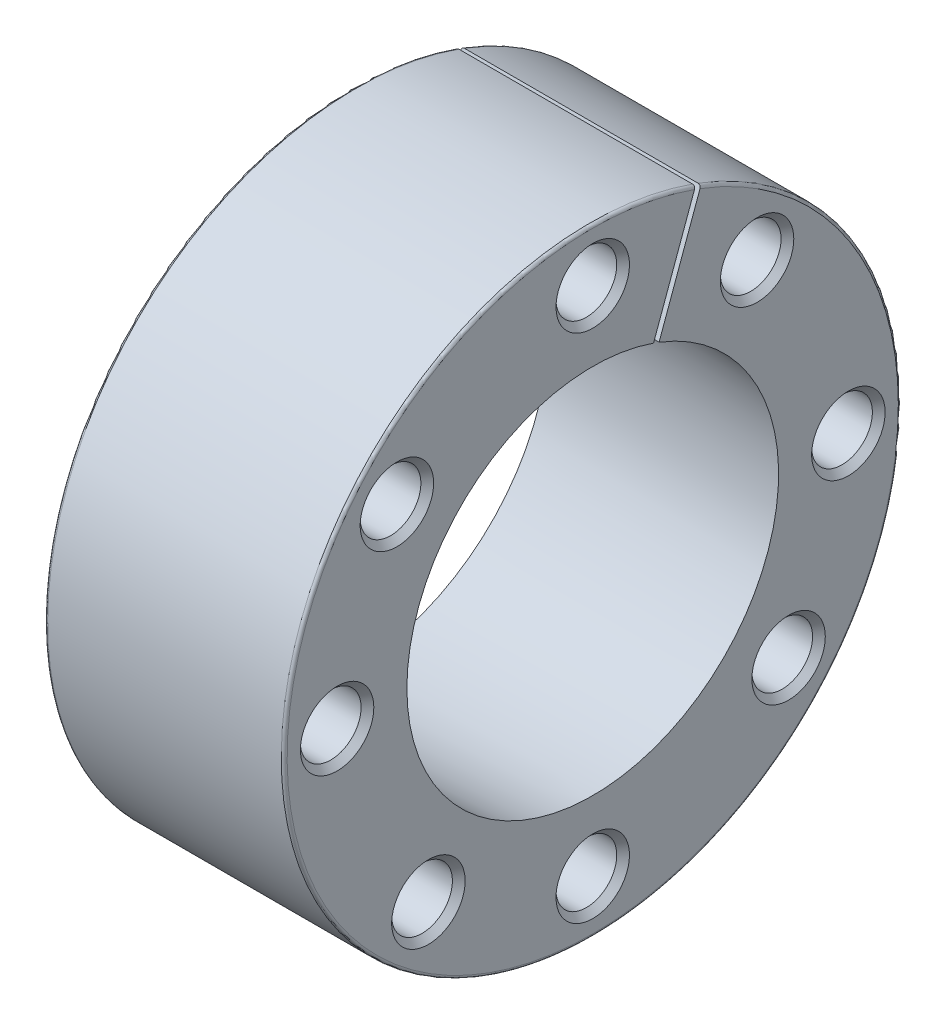
ISO-10303-21;
HEADER;
FILE_DESCRIPTION(('STEP AP214'),'2;1');
FILE_NAME('part.step','',(''),(''),'','','');
FILE_SCHEMA(('AUTOMOTIVE_DESIGN { 1 0 10303 214 1 1 1 1 }'));
ENDSEC;
DATA;
#1=APPLICATION_CONTEXT('core data for automotive mechanical design processes');
#2=APPLICATION_PROTOCOL_DEFINITION('international standard','automotive_design',2000,#1);
#3=PRODUCT_CONTEXT('',#1,'mechanical');
#4=PRODUCT('Part','Part','',(#3));
#5=PRODUCT_RELATED_PRODUCT_CATEGORY('part','',(#4));
#6=PRODUCT_DEFINITION_FORMATION('','',#4);
#7=PRODUCT_DEFINITION_CONTEXT('part definition',#1,'design');
#8=PRODUCT_DEFINITION('design','',#6,#7);
#9=PRODUCT_DEFINITION_SHAPE('','',#8);
#10=(LENGTH_UNIT() NAMED_UNIT(*) SI_UNIT(.MILLI.,.METRE.));
#11=(NAMED_UNIT(*) PLANE_ANGLE_UNIT() SI_UNIT($,.RADIAN.));
#12=(NAMED_UNIT(*) SI_UNIT($,.STERADIAN.) SOLID_ANGLE_UNIT());
#13=UNCERTAINTY_MEASURE_WITH_UNIT(LENGTH_MEASURE(1.E-05),#10,'distance_accuracy_value','');
#14=(GEOMETRIC_REPRESENTATION_CONTEXT(3) GLOBAL_UNCERTAINTY_ASSIGNED_CONTEXT((#13)) GLOBAL_UNIT_ASSIGNED_CONTEXT((#10,
#11,#12)) REPRESENTATION_CONTEXT('',''));
#15=CARTESIAN_POINT('',(0.,0.,0.));
#16=DIRECTION('',(0.,0.,1.));
#17=DIRECTION('',(1.,0.,0.));
#18=AXIS2_PLACEMENT_3D('',#15,#16,#17);
#19=CARTESIAN_POINT('',(25.1,17.4,0.));
#20=DIRECTION('',(-1.,0.,0.));
#21=DIRECTION('',(0.,0.,1.));
#22=AXIS2_PLACEMENT_3D('',#19,#20,#21);
#23=CYLINDRICAL_SURFACE('',#22,2.067);
#24=CARTESIAN_POINT('',(9.23299999999472,17.4,0.));
#25=DIRECTION('',(-1.,0.,0.));
#26=DIRECTION('',(0.,0.,1.));
#27=AXIS2_PLACEMENT_3D('',#24,#25,#26);
#28=CIRCLE('',#27,2.06699999995408);
#29=CARTESIAN_POINT('',(9.23299999999472,17.4,2.06699999995408));
#30=VERTEX_POINT('',#29);
#31=EDGE_CURVE('E222',#30,#30,#28,.T.);
#32=ORIENTED_EDGE('',*,*,#31,.T.);
#33=EDGE_LOOP('',(#32));
#34=FACE_BOUND('',#33,.T.);
#35=CARTESIAN_POINT('',(24.6670000000222,17.4,0.));
#36=DIRECTION('',(1.,0.,0.));
#37=DIRECTION('',(0.,0.,-1.));
#38=AXIS2_PLACEMENT_3D('',#35,#36,#37);
#39=CIRCLE('',#38,2.06700000001092);
#40=CARTESIAN_POINT('',(24.6670000000222,17.4,-2.06700000001092));
#41=VERTEX_POINT('',#40);
#42=EDGE_CURVE('E182',#41,#41,#39,.T.);
#43=ORIENTED_EDGE('',*,*,#42,.T.);
#44=EDGE_LOOP('',(#43));
#45=FACE_BOUND('',#44,.T.);
#46=ADVANCED_FACE('F16',(#34,#45),#23,.F.);
#47=CARTESIAN_POINT('',(25.1,13.3291733102702,-11.1845044085458));
#48=DIRECTION('',(-1.,0.,0.));
#49=DIRECTION('',(0.,0.,1.));
#50=AXIS2_PLACEMENT_3D('',#47,#48,#49);
#51=CYLINDRICAL_SURFACE('',#50,2.067);
#52=CARTESIAN_POINT('',(9.23299999999472,13.3291733102702,-11.1845044085458));
#53=DIRECTION('',(-1.,0.,0.));
#54=DIRECTION('',(0.,0.,1.));
#55=AXIS2_PLACEMENT_3D('',#52,#53,#54);
#56=CIRCLE('',#55,2.0669999999955);
#57=CARTESIAN_POINT('',(9.23299999999472,13.3291733102702,-9.1175044085503));
#58=VERTEX_POINT('',#57);
#59=EDGE_CURVE('E217',#58,#58,#56,.T.);
#60=ORIENTED_EDGE('',*,*,#59,.T.);
#61=EDGE_LOOP('',(#60));
#62=FACE_BOUND('',#61,.T.);
#63=CARTESIAN_POINT('',(24.6669999999654,13.3291733102702,-11.1845044085458));
#64=DIRECTION('',(1.,0.,0.));
#65=DIRECTION('',(0.,0.,-1.));
#66=AXIS2_PLACEMENT_3D('',#63,#64,#65);
#67=CIRCLE('',#66,2.0669999999695);
#68=CARTESIAN_POINT('',(24.6669999999654,13.3291733102702,-13.2515044085153));
#69=VERTEX_POINT('',#68);
#70=EDGE_CURVE('E177',#69,#69,#67,.T.);
#71=ORIENTED_EDGE('',*,*,#70,.T.);
#72=EDGE_LOOP('',(#71));
#73=FACE_BOUND('',#72,.T.);
#74=ADVANCED_FACE('F358',(#62,#73),#51,.F.);
#75=CARTESIAN_POINT('',(25.1,-11.1845044085458,-13.3291733102702));
#76=DIRECTION('',(-1.,0.,0.));
#77=DIRECTION('',(0.,0.,1.));
#78=AXIS2_PLACEMENT_3D('',#75,#76,#77);
#79=CYLINDRICAL_SURFACE('',#78,2.067);
#80=CARTESIAN_POINT('',(9.23300000005156,-11.1845044085458,-13.3291733102702));
#81=DIRECTION('',(-1.,0.,0.));
#82=DIRECTION('',(0.,0.,1.));
#83=AXIS2_PLACEMENT_3D('',#80,#81,#82);
#84=CIRCLE('',#83,2.06699999998464);
#85=CARTESIAN_POINT('',(9.23300000005156,-11.1845044085458,-11.2621733102856));
#86=VERTEX_POINT('',#85);
#87=EDGE_CURVE('E212',#86,#86,#84,.T.);
#88=ORIENTED_EDGE('',*,*,#87,.T.);
#89=EDGE_LOOP('',(#88));
#90=FACE_BOUND('',#89,.T.);
#91=CARTESIAN_POINT('',(24.6669999999654,-11.1845044085458,-13.3291733102702));
#92=DIRECTION('',(1.,0.,0.));
#93=DIRECTION('',(0.,0.,-1.));
#94=AXIS2_PLACEMENT_3D('',#91,#92,#93);
#95=CIRCLE('',#94,2.06699999992352);
#96=CARTESIAN_POINT('',(24.6669999999654,-11.1845044085458,-15.3961733101937));
#97=VERTEX_POINT('',#96);
#98=EDGE_CURVE('E172',#97,#97,#95,.T.);
#99=ORIENTED_EDGE('',*,*,#98,.T.);
#100=EDGE_LOOP('',(#99));
#101=FACE_BOUND('',#100,.T.);
#102=ADVANCED_FACE('F355',(#90,#101),#79,.F.);
#103=CARTESIAN_POINT('',(25.1,-13.3291733102702,11.1845044085458));
#104=DIRECTION('',(-1.,0.,0.));
#105=DIRECTION('',(0.,0.,1.));
#106=AXIS2_PLACEMENT_3D('',#103,#104,#105);
#107=CYLINDRICAL_SURFACE('',#106,2.067);
#108=CARTESIAN_POINT('',(9.23299999999472,-13.3291733102702,11.1845044085458));
#109=DIRECTION('',(-1.,0.,0.));
#110=DIRECTION('',(0.,0.,1.));
#111=AXIS2_PLACEMENT_3D('',#108,#109,#110);
#112=CIRCLE('',#111,2.06700000002634);
#113=CARTESIAN_POINT('',(9.23299999999472,-13.3291733102702,13.2515044085721));
#114=VERTEX_POINT('',#113);
#115=EDGE_CURVE('E207',#114,#114,#112,.T.);
#116=ORIENTED_EDGE('',*,*,#115,.T.);
#117=EDGE_LOOP('',(#116));
#118=FACE_BOUND('',#117,.T.);
#119=CARTESIAN_POINT('',(24.6669999999654,-13.3291733102702,11.1845044085458));
#120=DIRECTION('',(1.,0.,0.));
#121=DIRECTION('',(0.,0.,-1.));
#122=AXIS2_PLACEMENT_3D('',#119,#120,#121);
#123=CIRCLE('',#122,2.06699999993865);
#124=CARTESIAN_POINT('',(24.6669999999654,-13.3291733102702,9.11750440860715));
#125=VERTEX_POINT('',#124);
#126=EDGE_CURVE('E167',#125,#125,#123,.T.);
#127=ORIENTED_EDGE('',*,*,#126,.T.);
#128=EDGE_LOOP('',(#127));
#129=FACE_BOUND('',#128,.T.);
#130=ADVANCED_FACE('F351',(#118,#129),#107,.F.);
#131=CARTESIAN_POINT('',(25.1,11.1845044085458,13.3291733102702));
#132=DIRECTION('',(-1.,0.,0.));
#133=DIRECTION('',(0.,0.,1.));
#134=AXIS2_PLACEMENT_3D('',#131,#132,#133);
#135=CYLINDRICAL_SURFACE('',#134,2.067);
#136=CARTESIAN_POINT('',(9.23300000005156,11.1845044085458,13.3291733102702));
#137=DIRECTION('',(-1.,0.,0.));
#138=DIRECTION('',(0.,0.,1.));
#139=AXIS2_PLACEMENT_3D('',#136,#137,#138);
#140=CIRCLE('',#139,2.06699999998036);
#141=CARTESIAN_POINT('',(9.23300000005156,11.1845044085458,15.3961733102506));
#142=VERTEX_POINT('',#141);
#143=EDGE_CURVE('E202',#142,#142,#140,.T.);
#144=ORIENTED_EDGE('',*,*,#143,.T.);
#145=EDGE_LOOP('',(#144));
#146=FACE_BOUND('',#145,.T.);
#147=CARTESIAN_POINT('',(24.6669999999654,11.1845044085458,13.3291733102702));
#148=DIRECTION('',(1.,0.,0.));
#149=DIRECTION('',(0.,0.,-1.));
#150=AXIS2_PLACEMENT_3D('',#147,#148,#149);
#151=CIRCLE('',#150,2.06699999992779);
#152=CARTESIAN_POINT('',(24.6669999999654,11.1845044085458,11.2621733103424));
#153=VERTEX_POINT('',#152);
#154=EDGE_CURVE('E162',#153,#153,#151,.T.);
#155=ORIENTED_EDGE('',*,*,#154,.T.);
#156=EDGE_LOOP('',(#155));
#157=FACE_BOUND('',#156,.T.);
#158=ADVANCED_FACE('F347',(#146,#157),#135,.F.);
#159=CARTESIAN_POINT('',(25.1,0.,17.4));
#160=DIRECTION('',(-1.,0.,0.));
#161=DIRECTION('',(0.,0.,1.));
#162=AXIS2_PLACEMENT_3D('',#159,#160,#161);
#163=CYLINDRICAL_SURFACE('',#162,2.067);
#164=CARTESIAN_POINT('',(9.23299999999472,0.,17.4));
#165=DIRECTION('',(-1.,0.,0.));
#166=DIRECTION('',(0.,0.,1.));
#167=AXIS2_PLACEMENT_3D('',#164,#165,#166);
#168=CIRCLE('',#167,2.06700000002011);
#169=CARTESIAN_POINT('',(9.23299999999472,0.,19.4670000000201));
#170=VERTEX_POINT('',#169);
#171=EDGE_CURVE('E197',#170,#170,#168,.T.);
#172=ORIENTED_EDGE('',*,*,#171,.T.);
#173=EDGE_LOOP('',(#172));
#174=FACE_BOUND('',#173,.T.);
#175=CARTESIAN_POINT('',(24.6670000000222,0.,17.4));
#176=DIRECTION('',(1.,0.,0.));
#177=DIRECTION('',(0.,0.,-1.));
#178=AXIS2_PLACEMENT_3D('',#175,#176,#177);
#179=CIRCLE('',#178,2.06700000000173);
#180=CARTESIAN_POINT('',(24.6670000000222,0.,15.3329999999983));
#181=VERTEX_POINT('',#180);
#182=EDGE_CURVE('E157',#181,#181,#179,.T.);
#183=ORIENTED_EDGE('',*,*,#182,.T.);
#184=EDGE_LOOP('',(#183));
#185=FACE_BOUND('',#184,.T.);
#186=ADVANCED_FACE('F343',(#174,#185),#163,.F.);
#187=CARTESIAN_POINT('',(25.1,-17.4,0.));
#188=DIRECTION('',(-1.,0.,0.));
#189=DIRECTION('',(0.,0.,1.));
#190=AXIS2_PLACEMENT_3D('',#187,#188,#189);
#191=CYLINDRICAL_SURFACE('',#190,2.067);
#192=CARTESIAN_POINT('',(9.23299999999472,-17.4,0.));
#193=DIRECTION('',(-1.,0.,0.));
#194=DIRECTION('',(0.,0.,1.));
#195=AXIS2_PLACEMENT_3D('',#192,#193,#194);
#196=CIRCLE('',#195,2.06699999995408);
#197=CARTESIAN_POINT('',(9.23299999999472,-17.4,2.06699999995408));
#198=VERTEX_POINT('',#197);
#199=EDGE_CURVE('E192',#198,#198,#196,.T.);
#200=ORIENTED_EDGE('',*,*,#199,.T.);
#201=EDGE_LOOP('',(#200));
#202=FACE_BOUND('',#201,.T.);
#203=CARTESIAN_POINT('',(24.6670000000222,-17.4,0.));
#204=DIRECTION('',(1.,0.,0.));
#205=DIRECTION('',(0.,0.,-1.));
#206=AXIS2_PLACEMENT_3D('',#203,#204,#205);
#207=CIRCLE('',#206,2.06700000001092);
#208=CARTESIAN_POINT('',(24.6670000000222,-17.4,-2.06700000001092));
#209=VERTEX_POINT('',#208);
#210=EDGE_CURVE('E152',#209,#209,#207,.T.);
#211=ORIENTED_EDGE('',*,*,#210,.T.);
#212=EDGE_LOOP('',(#211));
#213=FACE_BOUND('',#212,.T.);
#214=ADVANCED_FACE('F339',(#202,#213),#191,.F.);
#215=CARTESIAN_POINT('',(25.1,0.,-17.4));
#216=DIRECTION('',(-1.,0.,0.));
#217=DIRECTION('',(0.,0.,1.));
#218=AXIS2_PLACEMENT_3D('',#215,#216,#217);
#219=CYLINDRICAL_SURFACE('',#218,2.067);
#220=CARTESIAN_POINT('',(9.23299999999472,0.,-17.4));
#221=DIRECTION('',(-1.,0.,0.));
#222=DIRECTION('',(0.,0.,1.));
#223=AXIS2_PLACEMENT_3D('',#220,#221,#222);
#224=CIRCLE('',#223,2.06700000005858);
#225=CARTESIAN_POINT('',(9.23299999999472,0.,-15.3329999999414));
#226=VERTEX_POINT('',#225);
#227=EDGE_CURVE('E187',#226,#226,#224,.T.);
#228=ORIENTED_EDGE('',*,*,#227,.T.);
#229=EDGE_LOOP('',(#228));
#230=FACE_BOUND('',#229,.T.);
#231=CARTESIAN_POINT('',(24.6670000000222,0.,-17.4));
#232=DIRECTION('',(1.,0.,0.));
#233=DIRECTION('',(0.,0.,-1.));
#234=AXIS2_PLACEMENT_3D('',#231,#232,#233);
#235=CIRCLE('',#234,2.06700000002011);
#236=CARTESIAN_POINT('',(24.6670000000222,0.,-19.4670000000201));
#237=VERTEX_POINT('',#236);
#238=EDGE_CURVE('E144',#237,#237,#235,.T.);
#239=ORIENTED_EDGE('',*,*,#238,.T.);
#240=EDGE_LOOP('',(#239));
#241=FACE_BOUND('',#240,.T.);
#242=ADVANCED_FACE('F335',(#230,#241),#219,.F.);
#243=CARTESIAN_POINT('',(8.79999999995107,17.4,0.));
#244=DIRECTION('',(-1.,0.,0.));
#245=DIRECTION('',(0.,0.,1.));
#246=AXIS2_PLACEMENT_3D('',#243,#244,#245);
#247=CONICAL_SURFACE('',#246,2.49999999999773,0.785398163397448);
#248=CARTESIAN_POINT('',(8.79999999995107,17.4,0.));
#249=DIRECTION('',(-1.,0.,0.));
#250=DIRECTION('',(0.,0.,1.));
#251=AXIS2_PLACEMENT_3D('',#248,#249,#250);
#252=CIRCLE('',#251,2.49999999999773);
#253=CARTESIAN_POINT('',(8.79999999995107,17.4,2.49999999999773));
#254=VERTEX_POINT('',#253);
#255=EDGE_CURVE('E19',#254,#254,#252,.F.);
#256=ORIENTED_EDGE('',*,*,#255,.F.);
#257=EDGE_LOOP('',(#256));
#258=FACE_BOUND('',#257,.T.);
#259=ORIENTED_EDGE('',*,*,#31,.F.);
#260=EDGE_LOOP('',(#259));
#261=FACE_BOUND('',#260,.T.);
#262=ADVANCED_FACE('F331',(#258,#261),#247,.F.);
#263=CARTESIAN_POINT('',(8.80000000006476,13.3291733102702,-11.1845044085458));
#264=DIRECTION('',(-1.,0.,0.));
#265=DIRECTION('',(0.,0.,1.));
#266=AXIS2_PLACEMENT_3D('',#263,#264,#265);
#267=CONICAL_SURFACE('',#266,2.49999999992546,0.785398163397448);
#268=CARTESIAN_POINT('',(8.80000000000791,13.3291733102702,-11.1845044085458));
#269=DIRECTION('',(-1.,0.,0.));
#270=DIRECTION('',(0.,0.,1.));
#271=AXIS2_PLACEMENT_3D('',#268,#269,#270);
#272=CIRCLE('',#271,2.4999999999823);
#273=CARTESIAN_POINT('',(8.80000000000791,13.3291733102702,-8.6845044085635));
#274=VERTEX_POINT('',#273);
#275=EDGE_CURVE('E424',#274,#274,#272,.F.);
#276=ORIENTED_EDGE('',*,*,#275,.F.);
#277=EDGE_LOOP('',(#276));
#278=FACE_BOUND('',#277,.T.);
#279=ORIENTED_EDGE('',*,*,#59,.F.);
#280=EDGE_LOOP('',(#279));
#281=FACE_BOUND('',#280,.T.);
#282=ADVANCED_FACE('F327',(#278,#281),#267,.F.);
#283=CARTESIAN_POINT('',(8.80000000000791,-11.1845044085458,-13.3291733102702));
#284=DIRECTION('',(-1.,0.,0.));
#285=DIRECTION('',(0.,0.,1.));
#286=AXIS2_PLACEMENT_3D('',#283,#284,#285);
#287=CONICAL_SURFACE('',#286,2.50000000002829,0.785398163397448);
#288=CARTESIAN_POINT('',(8.80000000000791,-11.1845044085458,-13.3291733102702));
#289=DIRECTION('',(-1.,0.,0.));
#290=DIRECTION('',(0.,0.,1.));
#291=AXIS2_PLACEMENT_3D('',#288,#289,#290);
#292=CIRCLE('',#291,2.50000000002829);
#293=CARTESIAN_POINT('',(8.80000000000791,-11.1845044085458,-10.8291733102419));
#294=VERTEX_POINT('',#293);
#295=EDGE_CURVE('E422',#294,#294,#292,.F.);
#296=ORIENTED_EDGE('',*,*,#295,.F.);
#297=EDGE_LOOP('',(#296));
#298=FACE_BOUND('',#297,.T.);
#299=ORIENTED_EDGE('',*,*,#87,.F.);
#300=EDGE_LOOP('',(#299));
#301=FACE_BOUND('',#300,.T.);
#302=ADVANCED_FACE('F323',(#298,#301),#287,.F.);
#303=CARTESIAN_POINT('',(8.79999999995107,-13.3291733102702,11.1845044085458));
#304=DIRECTION('',(-1.,0.,0.));
#305=DIRECTION('',(0.,0.,1.));
#306=AXIS2_PLACEMENT_3D('',#303,#304,#305);
#307=CONICAL_SURFACE('',#306,2.50000000006999,0.785398163397448);
#308=CARTESIAN_POINT('',(8.80000000000791,-13.3291733102702,11.1845044085458));
#309=DIRECTION('',(-1.,0.,0.));
#310=DIRECTION('',(0.,0.,1.));
#311=AXIS2_PLACEMENT_3D('',#308,#309,#310);
#312=CIRCLE('',#311,2.50000000001315);
#313=CARTESIAN_POINT('',(8.80000000000791,-13.3291733102702,13.684504408559));
#314=VERTEX_POINT('',#313);
#315=EDGE_CURVE('E419',#314,#314,#312,.F.);
#316=ORIENTED_EDGE('',*,*,#315,.F.);
#317=EDGE_LOOP('',(#316));
#318=FACE_BOUND('',#317,.T.);
#319=ORIENTED_EDGE('',*,*,#115,.F.);
#320=EDGE_LOOP('',(#319));
#321=FACE_BOUND('',#320,.T.);
#322=ADVANCED_FACE('F319',(#318,#321),#307,.F.);
#323=CARTESIAN_POINT('',(8.79999999995107,11.1845044085458,13.3291733102702));
#324=DIRECTION('',(-1.,0.,0.));
#325=DIRECTION('',(0.,0.,1.));
#326=AXIS2_PLACEMENT_3D('',#323,#324,#325);
#327=CONICAL_SURFACE('',#326,2.50000000008085,0.785398163397448);
#328=CARTESIAN_POINT('',(8.80000000000791,11.1845044085458,13.3291733102702));
#329=DIRECTION('',(-1.,0.,0.));
#330=DIRECTION('',(0.,0.,1.));
#331=AXIS2_PLACEMENT_3D('',#328,#329,#330);
#332=CIRCLE('',#331,2.50000000002401);
#333=CARTESIAN_POINT('',(8.80000000000791,11.1845044085458,15.8291733102942));
#334=VERTEX_POINT('',#333);
#335=EDGE_CURVE('E416',#334,#334,#332,.F.);
#336=ORIENTED_EDGE('',*,*,#335,.F.);
#337=EDGE_LOOP('',(#336));
#338=FACE_BOUND('',#337,.T.);
#339=ORIENTED_EDGE('',*,*,#143,.F.);
#340=EDGE_LOOP('',(#339));
#341=FACE_BOUND('',#340,.T.);
#342=ADVANCED_FACE('F315',(#338,#341),#327,.F.);
#343=CARTESIAN_POINT('',(8.79999999995107,0.,17.4));
#344=DIRECTION('',(-1.,0.,0.));
#345=DIRECTION('',(0.,0.,1.));
#346=AXIS2_PLACEMENT_3D('',#343,#344,#345);
#347=CONICAL_SURFACE('',#346,2.50000000006376,0.785398163397448);
#348=CARTESIAN_POINT('',(8.80000000000791,0.,17.4));
#349=DIRECTION('',(-1.,0.,0.));
#350=DIRECTION('',(0.,0.,1.));
#351=AXIS2_PLACEMENT_3D('',#348,#349,#350);
#352=CIRCLE('',#351,2.50000000000691);
#353=CARTESIAN_POINT('',(8.80000000000791,0.,19.9000000000069));
#354=VERTEX_POINT('',#353);
#355=EDGE_CURVE('E413',#354,#354,#352,.F.);
#356=ORIENTED_EDGE('',*,*,#355,.F.);
#357=EDGE_LOOP('',(#356));
#358=FACE_BOUND('',#357,.T.);
#359=ORIENTED_EDGE('',*,*,#171,.F.);
#360=EDGE_LOOP('',(#359));
#361=FACE_BOUND('',#360,.T.);
#362=ADVANCED_FACE('F311',(#358,#361),#347,.F.);
#363=CARTESIAN_POINT('',(8.79999999995107,-17.4,0.));
#364=DIRECTION('',(-1.,0.,0.));
#365=DIRECTION('',(0.,0.,1.));
#366=AXIS2_PLACEMENT_3D('',#363,#364,#365);
#367=CONICAL_SURFACE('',#366,2.49999999999773,0.785398163397448);
#368=CARTESIAN_POINT('',(8.79999999995107,-17.4,0.));
#369=DIRECTION('',(-1.,0.,0.));
#370=DIRECTION('',(0.,0.,1.));
#371=AXIS2_PLACEMENT_3D('',#368,#369,#370);
#372=CIRCLE('',#371,2.49999999999773);
#373=CARTESIAN_POINT('',(8.79999999995107,-17.4,2.49999999999773));
#374=VERTEX_POINT('',#373);
#375=EDGE_CURVE('E410',#374,#374,#372,.F.);
#376=ORIENTED_EDGE('',*,*,#375,.F.);
#377=EDGE_LOOP('',(#376));
#378=FACE_BOUND('',#377,.T.);
#379=ORIENTED_EDGE('',*,*,#199,.F.);
#380=EDGE_LOOP('',(#379));
#381=FACE_BOUND('',#380,.T.);
#382=ADVANCED_FACE('F307',(#378,#381),#367,.F.);
#383=CARTESIAN_POINT('',(8.80000000000791,0.,-17.4));
#384=DIRECTION('',(-1.,0.,0.));
#385=DIRECTION('',(0.,0.,1.));
#386=AXIS2_PLACEMENT_3D('',#383,#384,#385);
#387=CONICAL_SURFACE('',#386,2.49999999998854,0.785398163331809);
#388=CARTESIAN_POINT('',(8.80000000000791,0.,-17.4));
#389=DIRECTION('',(-1.,0.,0.));
#390=DIRECTION('',(0.,0.,1.));
#391=AXIS2_PLACEMENT_3D('',#388,#389,#390);
#392=CIRCLE('',#391,2.49999999998854);
#393=CARTESIAN_POINT('',(8.80000000000791,0.,-14.9000000000115));
#394=VERTEX_POINT('',#393);
#395=EDGE_CURVE('E88',#394,#394,#392,.F.);
#396=ORIENTED_EDGE('',*,*,#395,.F.);
#397=EDGE_LOOP('',(#396));
#398=FACE_BOUND('',#397,.T.);
#399=ORIENTED_EDGE('',*,*,#227,.F.);
#400=EDGE_LOOP('',(#399));
#401=FACE_BOUND('',#400,.T.);
#402=ADVANCED_FACE('F303',(#398,#401),#387,.F.);
#403=CARTESIAN_POINT('',(25.0999999999522,17.4,0.));
#404=DIRECTION('',(1.,0.,0.));
#405=DIRECTION('',(0.,1.,0.));
#406=AXIS2_PLACEMENT_3D('',#403,#404,#405);
#407=CONICAL_SURFACE('',#406,2.49999999994088,0.785398163397448);
#408=ORIENTED_EDGE('',*,*,#42,.F.);
#409=EDGE_LOOP('',(#408));
#410=FACE_BOUND('',#409,.T.);
#411=CARTESIAN_POINT('',(25.100000000009,17.4,0.));
#412=DIRECTION('',(1.,0.,0.));
#413=DIRECTION('',(0.,1.,0.));
#414=AXIS2_PLACEMENT_3D('',#411,#412,#413);
#415=CIRCLE('',#414,2.49999999999773);
#416=CARTESIAN_POINT('',(25.100000000009,19.8999999999977,0.));
#417=VERTEX_POINT('',#416);
#418=EDGE_CURVE('E404',#417,#417,#415,.F.);
#419=ORIENTED_EDGE('',*,*,#418,.F.);
#420=EDGE_LOOP('',(#419));
#421=FACE_BOUND('',#420,.T.);
#422=ADVANCED_FACE('F299',(#410,#421),#407,.F.);
#423=CARTESIAN_POINT('',(25.100000000009,13.3291733102702,-11.1845044085458));
#424=DIRECTION('',(1.,0.,0.));
#425=DIRECTION('',(0.,0.,-1.));
#426=AXIS2_PLACEMENT_3D('',#423,#424,#425);
#427=CONICAL_SURFACE('',#426,2.50000000001315,0.785398163397448);
#428=ORIENTED_EDGE('',*,*,#70,.F.);
#429=EDGE_LOOP('',(#428));
#430=FACE_BOUND('',#429,.T.);
#431=CARTESIAN_POINT('',(25.100000000009,13.3291733102702,-11.1845044085458));
#432=DIRECTION('',(1.,0.,0.));
#433=DIRECTION('',(0.,0.,-1.));
#434=AXIS2_PLACEMENT_3D('',#431,#432,#433);
#435=CIRCLE('',#434,2.50000000001315);
#436=CARTESIAN_POINT('',(25.100000000009,13.3291733102702,-13.684504408559));
#437=VERTEX_POINT('',#436);
#438=EDGE_CURVE('E401',#437,#437,#435,.F.);
#439=ORIENTED_EDGE('',*,*,#438,.F.);
#440=EDGE_LOOP('',(#439));
#441=FACE_BOUND('',#440,.T.);
#442=ADVANCED_FACE('F295',(#430,#441),#427,.F.);
#443=CARTESIAN_POINT('',(25.100000000009,-11.1845044085458,-13.3291733102702));
#444=DIRECTION('',(1.,0.,0.));
#445=DIRECTION('',(0.,0.,-1.));
#446=AXIS2_PLACEMENT_3D('',#443,#444,#445);
#447=CONICAL_SURFACE('',#446,2.49999999996717,0.785398163397448);
#448=ORIENTED_EDGE('',*,*,#98,.F.);
#449=EDGE_LOOP('',(#448));
#450=FACE_BOUND('',#449,.T.);
#451=CARTESIAN_POINT('',(25.100000000009,-11.1845044085458,-13.3291733102702));
#452=DIRECTION('',(1.,0.,0.));
#453=DIRECTION('',(0.,0.,-1.));
#454=AXIS2_PLACEMENT_3D('',#451,#452,#453);
#455=CIRCLE('',#454,2.49999999996717);
#456=CARTESIAN_POINT('',(25.100000000009,-11.1845044085458,-15.8291733102374));
#457=VERTEX_POINT('',#456);
#458=EDGE_CURVE('E398',#457,#457,#455,.F.);
#459=ORIENTED_EDGE('',*,*,#458,.F.);
#460=EDGE_LOOP('',(#459));
#461=FACE_BOUND('',#460,.T.);
#462=ADVANCED_FACE('F291',(#450,#461),#447,.F.);
#463=CARTESIAN_POINT('',(25.100000000009,-13.3291733102702,11.1845044085458));
#464=DIRECTION('',(1.,0.,0.));
#465=DIRECTION('',(0.,0.,-1.));
#466=AXIS2_PLACEMENT_3D('',#463,#464,#465);
#467=CONICAL_SURFACE('',#466,2.4999999999823,0.785398163397448);
#468=ORIENTED_EDGE('',*,*,#126,.F.);
#469=EDGE_LOOP('',(#468));
#470=FACE_BOUND('',#469,.T.);
#471=CARTESIAN_POINT('',(25.100000000009,-13.3291733102702,11.1845044085458));
#472=DIRECTION('',(1.,0.,0.));
#473=DIRECTION('',(0.,0.,-1.));
#474=AXIS2_PLACEMENT_3D('',#471,#472,#473);
#475=CIRCLE('',#474,2.4999999999823);
#476=CARTESIAN_POINT('',(25.100000000009,-13.3291733102702,8.6845044085635));
#477=VERTEX_POINT('',#476);
#478=EDGE_CURVE('E395',#477,#477,#475,.F.);
#479=ORIENTED_EDGE('',*,*,#478,.F.);
#480=EDGE_LOOP('',(#479));
#481=FACE_BOUND('',#480,.T.);
#482=ADVANCED_FACE('F287',(#470,#481),#467,.F.);
#483=CARTESIAN_POINT('',(25.100000000009,11.1845044085458,13.3291733102702));
#484=DIRECTION('',(1.,0.,0.));
#485=DIRECTION('',(0.,0.,-1.));
#486=AXIS2_PLACEMENT_3D('',#483,#484,#485);
#487=CONICAL_SURFACE('',#486,2.49999999997144,0.785398163397448);
#488=ORIENTED_EDGE('',*,*,#154,.F.);
#489=EDGE_LOOP('',(#488));
#490=FACE_BOUND('',#489,.T.);
#491=CARTESIAN_POINT('',(25.100000000009,11.1845044085458,13.3291733102702));
#492=DIRECTION('',(1.,0.,0.));
#493=DIRECTION('',(0.,0.,-1.));
#494=AXIS2_PLACEMENT_3D('',#491,#492,#493);
#495=CIRCLE('',#494,2.49999999997144);
#496=CARTESIAN_POINT('',(25.100000000009,11.1845044085458,10.8291733102988));
#497=VERTEX_POINT('',#496);
#498=EDGE_CURVE('E392',#497,#497,#495,.F.);
#499=ORIENTED_EDGE('',*,*,#498,.F.);
#500=EDGE_LOOP('',(#499));
#501=FACE_BOUND('',#500,.T.);
#502=ADVANCED_FACE('F283',(#490,#501),#487,.F.);
#503=CARTESIAN_POINT('',(25.100000000009,0.,17.4));
#504=DIRECTION('',(1.,0.,0.));
#505=DIRECTION('',(0.,0.,-1.));
#506=AXIS2_PLACEMENT_3D('',#503,#504,#505);
#507=CONICAL_SURFACE('',#506,2.49999999998854,0.785398163397448);
#508=ORIENTED_EDGE('',*,*,#182,.F.);
#509=EDGE_LOOP('',(#508));
#510=FACE_BOUND('',#509,.T.);
#511=CARTESIAN_POINT('',(25.100000000009,0.,17.4));
#512=DIRECTION('',(1.,0.,0.));
#513=DIRECTION('',(0.,0.,-1.));
#514=AXIS2_PLACEMENT_3D('',#511,#512,#513);
#515=CIRCLE('',#514,2.49999999998854);
#516=CARTESIAN_POINT('',(25.100000000009,0.,14.9000000000115));
#517=VERTEX_POINT('',#516);
#518=EDGE_CURVE('E389',#517,#517,#515,.F.);
#519=ORIENTED_EDGE('',*,*,#518,.F.);
#520=EDGE_LOOP('',(#519));
#521=FACE_BOUND('',#520,.T.);
#522=ADVANCED_FACE('F279',(#510,#521),#507,.F.);
#523=CARTESIAN_POINT('',(25.0999999999522,-17.4,0.));
#524=DIRECTION('',(1.,0.,0.));
#525=DIRECTION('',(0.,1.,0.));
#526=AXIS2_PLACEMENT_3D('',#523,#524,#525);
#527=CONICAL_SURFACE('',#526,2.49999999994088,0.785398163397448);
#528=ORIENTED_EDGE('',*,*,#210,.F.);
#529=EDGE_LOOP('',(#528));
#530=FACE_BOUND('',#529,.T.);
#531=CARTESIAN_POINT('',(25.100000000009,-17.4,0.));
#532=DIRECTION('',(1.,0.,0.));
#533=DIRECTION('',(0.,1.,0.));
#534=AXIS2_PLACEMENT_3D('',#531,#532,#533);
#535=CIRCLE('',#534,2.49999999999773);
#536=CARTESIAN_POINT('',(25.100000000009,-14.9000000000023,0.));
#537=VERTEX_POINT('',#536);
#538=EDGE_CURVE('E386',#537,#537,#535,.F.);
#539=ORIENTED_EDGE('',*,*,#538,.F.);
#540=EDGE_LOOP('',(#539));
#541=FACE_BOUND('',#540,.T.);
#542=ADVANCED_FACE('F275',(#530,#541),#527,.F.);
#543=CARTESIAN_POINT('',(25.100000000009,0.,-17.4));
#544=DIRECTION('',(1.,0.,0.));
#545=DIRECTION('',(0.,0.,-1.));
#546=AXIS2_PLACEMENT_3D('',#543,#544,#545);
#547=CONICAL_SURFACE('',#546,2.50000000000691,0.785398163397448);
#548=ORIENTED_EDGE('',*,*,#238,.F.);
#549=EDGE_LOOP('',(#548));
#550=FACE_BOUND('',#549,.T.);
#551=CARTESIAN_POINT('',(25.100000000009,0.,-17.4));
#552=DIRECTION('',(1.,0.,0.));
#553=DIRECTION('',(0.,0.,-1.));
#554=AXIS2_PLACEMENT_3D('',#551,#552,#553);
#555=CIRCLE('',#554,2.50000000000691);
#556=CARTESIAN_POINT('',(25.100000000009,0.,-19.9000000000069));
#557=VERTEX_POINT('',#556);
#558=EDGE_CURVE('E383',#557,#557,#555,.F.);
#559=ORIENTED_EDGE('',*,*,#558,.F.);
#560=EDGE_LOOP('',(#559));
#561=FACE_BOUND('',#560,.T.);
#562=ADVANCED_FACE('F271',(#550,#561),#547,.F.);
#563=CARTESIAN_POINT('',(8.8,20.8,0.));
#564=DIRECTION('',(-1.,0.,0.));
#565=DIRECTION('',(0.,0.,1.));
#566=AXIS2_PLACEMENT_3D('',#563,#564,#565);
#567=PLANE('',#566);
#568=ORIENTED_EDGE('',*,*,#395,.T.);
#569=EDGE_LOOP('',(#568));
#570=FACE_BOUND('',#569,.T.);
#571=ORIENTED_EDGE('',*,*,#375,.T.);
#572=EDGE_LOOP('',(#571));
#573=FACE_BOUND('',#572,.T.);
#574=ORIENTED_EDGE('',*,*,#355,.T.);
#575=EDGE_LOOP('',(#574));
#576=FACE_BOUND('',#575,.T.);
#577=ORIENTED_EDGE('',*,*,#335,.T.);
#578=EDGE_LOOP('',(#577));
#579=FACE_BOUND('',#578,.T.);
#580=ORIENTED_EDGE('',*,*,#315,.T.);
#581=EDGE_LOOP('',(#580));
#582=FACE_BOUND('',#581,.T.);
#583=ORIENTED_EDGE('',*,*,#295,.T.);
#584=EDGE_LOOP('',(#583));
#585=FACE_BOUND('',#584,.T.);
#586=ORIENTED_EDGE('',*,*,#275,.T.);
#587=EDGE_LOOP('',(#586));
#588=FACE_BOUND('',#587,.T.);
#589=ORIENTED_EDGE('',*,*,#255,.T.);
#590=EDGE_LOOP('',(#589));
#591=FACE_BOUND('',#590,.T.);
#592=DIRECTION('',(0.,-0.939692620785908,0.342020143325669));
#593=VECTOR('',#592,1.);
#594=CARTESIAN_POINT('',(8.79999999999755,-0.0684040286651337,-0.187938524157182));
#595=LINE('',#594,#593);
#596=CARTESIAN_POINT('',(8.79999999999902,19.4762989121996,-7.30162863220704));
#597=VERTEX_POINT('',#596);
#598=CARTESIAN_POINT('',(8.79999999999876,12.4280946762841,-4.73629208530484));
#599=VERTEX_POINT('',#598);
#600=EDGE_CURVE('E83',#597,#599,#595,.T.);
#601=ORIENTED_EDGE('',*,*,#600,.F.);
#602=CARTESIAN_POINT('',(8.8,0.,0.));
#603=DIRECTION('',(1.,0.,0.));
#604=DIRECTION('',(0.,0.942937835073537,-0.332968826148683));
#605=AXIS2_PLACEMENT_3D('',#602,#603,#604);
#606=CIRCLE('',#605,20.8000000000002);
#607=CARTESIAN_POINT('',(8.79999999999902,19.6131069695298,-6.92575158389268));
#608=VERTEX_POINT('',#607);
#609=EDGE_CURVE('E104',#608,#597,#606,.T.);
#610=ORIENTED_EDGE('',*,*,#609,.F.);
#611=DIRECTION('',(0.,-0.939692620785908,0.342020143325669));
#612=VECTOR('',#611,1.);
#613=CARTESIAN_POINT('',(8.79999999999755,0.0684040286651337,0.187938524157182));
#614=LINE('',#613,#612);
#615=CARTESIAN_POINT('',(8.79999999999876,12.5649027336143,-4.36041503699046));
#616=VERTEX_POINT('',#615);
#617=EDGE_CURVE('E62',#608,#616,#614,.T.);
#618=ORIENTED_EDGE('',*,*,#617,.T.);
#619=CARTESIAN_POINT('',(8.79999999999997,0.,0.));
#620=DIRECTION('',(-1.,0.,0.));
#621=DIRECTION('',(0.,-1.,0.));
#622=AXIS2_PLACEMENT_3D('',#619,#620,#621);
#623=CIRCLE('',#622,13.3);
#624=EDGE_CURVE('E79',#616,#599,#623,.F.);
#625=ORIENTED_EDGE('',*,*,#624,.T.);
#626=EDGE_LOOP('',(#601,#610,#618,#625));
#627=FACE_BOUND('',#626,.T.);
#628=ADVANCED_FACE('F81',(#570,#573,#576,#579,#582,#585,#588,#591,#627),#567,.T.);
#629=CARTESIAN_POINT('',(8.79999999999996,0.,0.));
#630=DIRECTION('',(-1.,0.,0.));
#631=DIRECTION('',(0.,-1.,0.));
#632=AXIS2_PLACEMENT_3D('',#629,#630,#631);
#633=CONICAL_SURFACE('',#632,13.3,0.0398561831425235);
#634=CARTESIAN_POINT('',(25.1,0.,0.));
#635=DIRECTION('',(-1.,0.,0.));
#636=DIRECTION('',(0.,-1.,0.));
#637=AXIS2_PLACEMENT_3D('',#634,#635,#636);
#638=CIRCLE('',#637,12.65);
#639=CARTESIAN_POINT('',(25.1,11.8172218513902,-4.51395256012136));
#640=VERTEX_POINT('',#639);
#641=CARTESIAN_POINT('',(25.1,11.9540299087205,-4.13807551180699));
#642=VERTEX_POINT('',#641);
#643=EDGE_CURVE('E87',#640,#642,#638,.T.);
#644=ORIENTED_EDGE('',*,*,#643,.F.);
#645=DIRECTION('',(0.999205658839405,-0.0374470910101289,0.0136296264875444));
#646=VECTOR('',#645,1.);
#647=CARTESIAN_POINT('',(8.79999999999875,12.4280946762841,-4.73629208530484));
#648=LINE('',#647,#646);
#649=EDGE_CURVE('E90',#599,#640,#648,.T.);
#650=ORIENTED_EDGE('',*,*,#649,.F.);
#651=ORIENTED_EDGE('',*,*,#624,.F.);
#652=DIRECTION('',(-0.999205658839405,0.0374470910101289,-0.0136296264875444));
#653=VECTOR('',#652,1.);
#654=CARTESIAN_POINT('',(25.1,11.9540299087205,-4.13807551180701));
#655=LINE('',#654,#653);
#656=EDGE_CURVE('E375',#616,#642,#655,.F.);
#657=ORIENTED_EDGE('',*,*,#656,.T.);
#658=EDGE_LOOP('',(#644,#650,#651,#657));
#659=FACE_BOUND('',#658,.T.);
#660=ADVANCED_FACE('F91',(#659),#633,.F.);
#661=CARTESIAN_POINT('',(25.1,12.65,0.));
#662=DIRECTION('',(1.,0.,0.));
#663=DIRECTION('',(0.,0.,-1.));
#664=AXIS2_PLACEMENT_3D('',#661,#662,#663);
#665=PLANE('',#664);
#666=ORIENTED_EDGE('',*,*,#558,.T.);
#667=EDGE_LOOP('',(#666));
#668=FACE_BOUND('',#667,.T.);
#669=ORIENTED_EDGE('',*,*,#538,.T.);
#670=EDGE_LOOP('',(#669));
#671=FACE_BOUND('',#670,.T.);
#672=ORIENTED_EDGE('',*,*,#518,.T.);
#673=EDGE_LOOP('',(#672));
#674=FACE_BOUND('',#673,.T.);
#675=ORIENTED_EDGE('',*,*,#498,.T.);
#676=EDGE_LOOP('',(#675));
#677=FACE_BOUND('',#676,.T.);
#678=ORIENTED_EDGE('',*,*,#478,.T.);
#679=EDGE_LOOP('',(#678));
#680=FACE_BOUND('',#679,.T.);
#681=ORIENTED_EDGE('',*,*,#458,.T.);
#682=EDGE_LOOP('',(#681));
#683=FACE_BOUND('',#682,.T.);
#684=ORIENTED_EDGE('',*,*,#438,.T.);
#685=EDGE_LOOP('',(#684));
#686=FACE_BOUND('',#685,.T.);
#687=ORIENTED_EDGE('',*,*,#418,.T.);
#688=EDGE_LOOP('',(#687));
#689=FACE_BOUND('',#688,.T.);
#690=DIRECTION('',(0.,-0.939692620785908,0.342020143325669));
#691=VECTOR('',#690,1.);
#692=CARTESIAN_POINT('',(25.1,-0.0684040286651337,-0.187938524157182));
#693=LINE('',#692,#691);
#694=CARTESIAN_POINT('',(25.100000000001,19.476298912199,-7.30162863220685));
#695=VERTEX_POINT('',#694);
#696=EDGE_CURVE('E71',#640,#695,#693,.F.);
#697=ORIENTED_EDGE('',*,*,#696,.F.);
#698=ORIENTED_EDGE('',*,*,#643,.T.);
#699=DIRECTION('',(0.,-0.939692620785908,0.342020143325669));
#700=VECTOR('',#699,1.);
#701=CARTESIAN_POINT('',(25.1,0.0684040286651337,0.187938524157182));
#702=LINE('',#701,#700);
#703=CARTESIAN_POINT('',(25.100000000001,19.6131069695293,-6.92575158389248));
#704=VERTEX_POINT('',#703);
#705=EDGE_CURVE('E76',#642,#704,#702,.F.);
#706=ORIENTED_EDGE('',*,*,#705,.T.);
#707=CARTESIAN_POINT('',(25.1,0.,0.));
#708=DIRECTION('',(-1.,0.,0.));
#709=DIRECTION('',(0.,0.936360524624966,-0.351039838086874));
#710=AXIS2_PLACEMENT_3D('',#707,#708,#709);
#711=CIRCLE('',#710,20.7999999999997);
#712=EDGE_CURVE('E230',#695,#704,#711,.T.);
#713=ORIENTED_EDGE('',*,*,#712,.F.);
#714=EDGE_LOOP('',(#697,#698,#706,#713));
#715=FACE_BOUND('',#714,.T.);
#716=ADVANCED_FACE('F438',(#668,#671,#674,#677,#680,#683,#686,#689,#715),#665,.T.);
#717=CARTESIAN_POINT('',(0.,0.0684040286651337,0.187938524157182));
#718=DIRECTION('',(0.,0.342020143325669,0.939692620785908));
#719=DIRECTION('',(0.,-0.939692620785908,0.342020143325669));
#720=AXIS2_PLACEMENT_3D('',#717,#718,#719);
#721=PLANE('',#720);
#722=ORIENTED_EDGE('',*,*,#617,.F.);
#723=CARTESIAN_POINT('',(9.00000000000001,19.8010540995216,-6.99415874482546));
#724=CARTESIAN_POINT('',(8.98874871039083,19.8010630813869,-6.99416201395699));
#725=CARTESIAN_POINT('',(8.97750027893239,19.800162417974,-6.99383419928365));
#726=CARTESIAN_POINT('',(8.9553302343261,19.7966080841105,-6.99254052755478));
#727=CARTESIAN_POINT('',(8.94440837137737,19.7939557913473,-6.99157517193645));
#728=CARTESIAN_POINT('',(8.92318881487377,19.7869626132771,-6.98902986327595));
#729=CARTESIAN_POINT('',(8.91289142349432,19.7826209179035,-6.98744961539363));
#730=CARTESIAN_POINT('',(8.89322010714611,19.772375993498,-6.98372076785774));
#731=CARTESIAN_POINT('',(8.8838460202293,19.7664730389836,-6.98157226812033));
#732=CARTESIAN_POINT('',(8.86628438472506,19.7532713643379,-6.97676725150683));
#733=CARTESIAN_POINT('',(8.85809697385623,19.7459724824312,-6.9741106757493));
#734=CARTESIAN_POINT('',(8.84314240630231,19.7301866076333,-6.968365087201));
#735=CARTESIAN_POINT('',(8.83637522726239,19.7216996334465,-6.96527608121807));
#736=CARTESIAN_POINT('',(8.82445112259894,19.7037764999121,-6.95875259410678));
#737=CARTESIAN_POINT('',(8.81929475204093,19.6943400148519,-6.95531799442874));
#738=CARTESIAN_POINT('',(8.81074371469595,19.6747893861158,-6.94820214750759));
#739=CARTESIAN_POINT('',(8.80734801724156,19.6646756428195,-6.94452104599076));
#740=CARTESIAN_POINT('',(8.80325827325558,19.6476012081256,-6.93830645999524));
#741=CARTESIAN_POINT('',(8.80203715904261,19.6407478964451,-6.93581205853737));
#742=CARTESIAN_POINT('',(8.80040812966556,19.6269663369352,-6.93079598109398));
#743=CARTESIAN_POINT('',(8.79999906166815,19.6200382093986,-6.92827434889147));
#744=CARTESIAN_POINT('',(8.8,19.6131069695298,-6.92575158389268));
#745=B_SPLINE_CURVE_WITH_KNOTS('',3,(#723,#724,#725,#726,#727,#728,#729,#730,#731,#732,#733,
#734,#735,#736,#737,#738,#739,#740,#741,#742,#743,#744),.UNSPECIFIED.,.F.,.F.,(4,2,2,2,2,2,2,2,
2,2,4),(0.,0.0337090216359919,0.0673915620569914,0.101090273160533,0.134783062928115,
0.1684797597561,0.202175926149512,0.235883691067402,0.269571701705187,0.291713589253883,
0.313824020202552),.UNSPECIFIED.);
#746=CARTESIAN_POINT('',(9.,19.8010540995216,-6.99415874482545));
#747=VERTEX_POINT('',#746);
#748=EDGE_CURVE('E374',#747,#608,#745,.T.);
#749=ORIENTED_EDGE('',*,*,#748,.F.);
#750=DIRECTION('',(-1.,0.,0.));
#751=VECTOR('',#750,1.);
#752=CARTESIAN_POINT('',(50.,19.8010540995216,-6.99415874482544));
#753=LINE('',#752,#751);
#754=CARTESIAN_POINT('',(24.9,19.8010540995216,-6.99415874482545));
#755=VERTEX_POINT('',#754);
#756=EDGE_CURVE('E110',#755,#747,#753,.T.);
#757=ORIENTED_EDGE('',*,*,#756,.F.);
#758=CARTESIAN_POINT('',(25.1,19.6131069695293,-6.92575158389249));
#759=CARTESIAN_POINT('',(25.1000095544643,19.6236809087356,-6.92960018302251));
#760=CARTESIAN_POINT('',(25.0990510098546,19.6342521679104,-6.93344780670084));
#761=CARTESIAN_POINT('',(25.0952682233213,19.6550875812227,-6.9410312769652));
#762=CARTESIAN_POINT('',(25.0924454427166,19.6653519693253,-6.94476720870753));
#763=CARTESIAN_POINT('',(25.0850026932635,19.6852941667383,-6.95202557497169));
#764=CARTESIAN_POINT('',(25.0803818606188,19.6949716915289,-6.9555479059368));
#765=CARTESIAN_POINT('',(25.0694781822078,19.7134588255203,-6.96227667242658));
#766=CARTESIAN_POINT('',(25.063195629859,19.7222685875695,-6.96548316358353));
#767=CARTESIAN_POINT('',(25.0491451796171,19.7387725595527,-6.97149011813255));
#768=CARTESIAN_POINT('',(25.0413771696863,19.7464666852648,-6.97429055087041));
#769=CARTESIAN_POINT('',(25.0245766103056,19.7605200846423,-6.97940556993411));
#770=CARTESIAN_POINT('',(25.0155440817224,19.7668793803303,-6.9817201642755));
#771=CARTESIAN_POINT('',(24.9964695967111,19.778083991661,-6.98579830928638));
#772=CARTESIAN_POINT('',(24.9864273800799,19.7829289157116,-6.98756171742802));
#773=CARTESIAN_POINT('',(24.9656218403357,19.7909631401761,-6.99048593598851));
#774=CARTESIAN_POINT('',(24.9548589442309,19.7941534113531,-6.99164709973627));
#775=CARTESIAN_POINT('',(24.9366917784189,19.7979946274769,-6.9930451880687));
#776=CARTESIAN_POINT('',(24.9294018262828,19.7991412362927,-6.99346251954795));
#777=CARTESIAN_POINT('',(24.9147422684284,19.8006708711156,-6.99401926109272));
#778=CARTESIAN_POINT('',(24.9073727905931,19.8010549796694,-6.99415906517299));
#779=CARTESIAN_POINT('',(24.9,19.8010540995216,-6.99415874482545));
#780=B_SPLINE_CURVE_WITH_KNOTS('',3,(#758,#759,#760,#761,#762,#763,#764,#765,#766,#767,#768,
#769,#770,#771,#772,#773,#774,#775,#776,#777,#778,#779),.UNSPECIFIED.,.F.,.F.,(4,2,2,2,2,2,2,2,
2,2,4),(0.,0.0337128138407915,0.0673992325287476,0.101101854417277,0.13479852924493,
0.168497746582651,0.202196407893017,0.235903775937927,0.269591345878027,0.291723389149643,
0.313823988297694),.UNSPECIFIED.);
#781=EDGE_CURVE('E92',#704,#755,#780,.T.);
#782=ORIENTED_EDGE('',*,*,#781,.F.);
#783=ORIENTED_EDGE('',*,*,#705,.F.);
#784=ORIENTED_EDGE('',*,*,#656,.F.);
#785=EDGE_LOOP('',(#722,#749,#757,#782,#783,#784));
#786=FACE_BOUND('',#785,.T.);
#787=ADVANCED_FACE('F122',(#786),#721,.F.);
#788=CARTESIAN_POINT('',(9.00000000000001,0.,0.));
#789=DIRECTION('',(1.,0.,0.));
#790=DIRECTION('',(0.,0.,-1.));
#791=AXIS2_PLACEMENT_3D('',#788,#789,#790);
#792=TOROIDAL_SURFACE('',#791,20.8,0.200000000000016);
#793=CARTESIAN_POINT('',(9.00000000000001,19.6642460421914,-7.37003579313982));
#794=CARTESIAN_POINT('',(8.98874871039083,19.6642550240566,-7.37003906227149));
#795=CARTESIAN_POINT('',(8.97750027893239,19.6633543606437,-7.36971124759809));
#796=CARTESIAN_POINT('',(8.9553302343261,19.6598000267803,-7.36841757586906));
#797=CARTESIAN_POINT('',(8.94440837137737,19.6571477340171,-7.36745222025062));
#798=CARTESIAN_POINT('',(8.92318881487377,19.6501545559469,-7.36490691159017));
#799=CARTESIAN_POINT('',(8.91289142349432,19.6458128605732,-7.363326663708));
#800=CARTESIAN_POINT('',(8.89322010714611,19.6355679361678,-7.3595978161721));
#801=CARTESIAN_POINT('',(8.8838460202293,19.6296649816533,-7.35744931643455));
#802=CARTESIAN_POINT('',(8.86628438472506,19.6164633070077,-7.35264429982105));
#803=CARTESIAN_POINT('',(8.85809697385623,19.6091644251009,-7.34998772406365));
#804=CARTESIAN_POINT('',(8.84314240630231,19.593378550303,-7.34424213551538));
#805=CARTESIAN_POINT('',(8.83637522726239,19.5848915761162,-7.34115312953234));
#806=CARTESIAN_POINT('',(8.82445112259894,19.5669684425818,-7.33462964242103));
#807=CARTESIAN_POINT('',(8.81929475204093,19.5575319575217,-7.33119504274309));
#808=CARTESIAN_POINT('',(8.81074371469594,19.5379813287856,-7.32407919582197));
#809=CARTESIAN_POINT('',(8.80734801724155,19.5278675854893,-7.32039809430507));
#810=CARTESIAN_POINT('',(8.80325827325558,19.5107931507953,-7.31418350830955));
#811=CARTESIAN_POINT('',(8.80203715904261,19.5039398391148,-7.31168910685171));
#812=CARTESIAN_POINT('',(8.80040812966556,19.4901582796049,-7.30667302940837));
#813=CARTESIAN_POINT('',(8.79999906166815,19.4832301520684,-7.30415139720587));
#814=CARTESIAN_POINT('',(8.8,19.4762989121996,-7.30162863220705));
#815=B_SPLINE_CURVE_WITH_KNOTS('',3,(#793,#794,#795,#796,#797,#798,#799,#800,#801,#802,#803,
#804,#805,#806,#807,#808,#809,#810,#811,#812,#813,#814),.UNSPECIFIED.,.F.,.F.,(4,2,2,2,2,2,2,2,
2,2,4),(0.,0.0337090216359904,0.0673915620569919,0.101090273160535,0.134783062928113,
0.168479759756101,0.202175926149516,0.23588369106741,0.269571701705197,0.291713589253871,
0.313824020202511),.UNSPECIFIED.);
#816=CARTESIAN_POINT('',(9.,19.6642460421914,-7.37003579313982));
#817=VERTEX_POINT('',#816);
#818=EDGE_CURVE('E95',#817,#597,#815,.T.);
#819=ORIENTED_EDGE('',*,*,#818,.F.);
#820=CARTESIAN_POINT('',(9.,0.,0.));
#821=DIRECTION('',(-1.,0.,0.));
#822=DIRECTION('',(0.,0.,1.));
#823=AXIS2_PLACEMENT_3D('',#820,#821,#822);
#824=CIRCLE('',#823,21.);
#825=EDGE_CURVE('E107',#747,#817,#824,.F.);
#826=ORIENTED_EDGE('',*,*,#825,.F.);
#827=ORIENTED_EDGE('',*,*,#748,.T.);
#828=ORIENTED_EDGE('',*,*,#609,.T.);
#829=EDGE_LOOP('',(#819,#826,#827,#828));
#830=FACE_BOUND('',#829,.T.);
#831=ADVANCED_FACE('F117',(#830),#792,.T.);
#832=CARTESIAN_POINT('',(0.,-0.0684040286651337,-0.187938524157182));
#833=DIRECTION('',(0.,0.342020143325669,0.939692620785908));
#834=DIRECTION('',(0.,-0.939692620785908,0.342020143325669));
#835=AXIS2_PLACEMENT_3D('',#832,#833,#834);
#836=PLANE('',#835);
#837=ORIENTED_EDGE('',*,*,#600,.T.);
#838=ORIENTED_EDGE('',*,*,#649,.T.);
#839=ORIENTED_EDGE('',*,*,#696,.T.);
#840=CARTESIAN_POINT('',(24.9,19.6642460421914,-7.37003579313982));
#841=CARTESIAN_POINT('',(24.9112512896092,19.6642550240566,-7.37003906227145));
#842=CARTESIAN_POINT('',(24.9224997210676,19.6633543606437,-7.36971124759807));
#843=CARTESIAN_POINT('',(24.9446697656739,19.6598000267803,-7.36841757586908));
#844=CARTESIAN_POINT('',(24.9555916286226,19.657147734017,-7.36745222025067));
#845=CARTESIAN_POINT('',(24.9768111851262,19.6501545559468,-7.3649069115902));
#846=CARTESIAN_POINT('',(24.9871085765057,19.6458128605732,-7.36332666370799));
#847=CARTESIAN_POINT('',(25.0067798928539,19.6355679361678,-7.3595978161721));
#848=CARTESIAN_POINT('',(25.0161539797707,19.6296649816533,-7.35744931643458));
#849=CARTESIAN_POINT('',(25.0337156152749,19.6164633070076,-7.35264429982108));
#850=CARTESIAN_POINT('',(25.0419030261438,19.6091644251009,-7.34998772406365));
#851=CARTESIAN_POINT('',(25.0568575936977,19.593378550303,-7.34424213551537));
#852=CARTESIAN_POINT('',(25.0636247727376,19.5848915761162,-7.34115312953236));
#853=CARTESIAN_POINT('',(25.0755488774011,19.5669684425818,-7.33462964242106));
#854=CARTESIAN_POINT('',(25.0807052479591,19.5575319575217,-7.3311950427431));
#855=CARTESIAN_POINT('',(25.0892562853041,19.5379813287856,-7.32407919582197));
#856=CARTESIAN_POINT('',(25.0926519827584,19.5278675854893,-7.32039809430509));
#857=CARTESIAN_POINT('',(25.0967417267444,19.5107931507952,-7.31418350830953));
#858=CARTESIAN_POINT('',(25.0979628409574,19.5039398391146,-7.31168910685165));
#859=CARTESIAN_POINT('',(25.0995918703345,19.4901582796046,-7.30667302940823));
#860=CARTESIAN_POINT('',(25.1000009383319,19.4832301520679,-7.30415139720569));
#861=CARTESIAN_POINT('',(25.1,19.476298912199,-7.30162863220684));
#862=B_SPLINE_CURVE_WITH_KNOTS('',3,(#840,#841,#842,#843,#844,#845,#846,#847,#848,#849,#850,
#851,#852,#853,#854,#855,#856,#857,#858,#859,#860,#861),.UNSPECIFIED.,.F.,.F.,(4,2,2,2,2,2,2,2,
2,2,4),(0.,0.0337090216359936,0.0673915620569897,0.101090273160529,0.134783062928105,
0.168479759756092,0.202175926149503,0.235883691067388,0.269571701705172,0.291713589254156,
0.313824020203111),.UNSPECIFIED.);
#863=CARTESIAN_POINT('',(24.9,19.6642460421913,-7.37003579313982));
#864=VERTEX_POINT('',#863);
#865=EDGE_CURVE('E34',#864,#695,#862,.T.);
#866=ORIENTED_EDGE('',*,*,#865,.F.);
#867=DIRECTION('',(-1.,0.,0.));
#868=VECTOR('',#867,1.);
#869=CARTESIAN_POINT('',(50.,19.6642460421913,-7.37003579313983));
#870=LINE('',#869,#868);
#871=EDGE_CURVE('E25',#817,#864,#870,.F.);
#872=ORIENTED_EDGE('',*,*,#871,.F.);
#873=ORIENTED_EDGE('',*,*,#818,.T.);
#874=EDGE_LOOP('',(#837,#838,#839,#866,#872,#873));
#875=FACE_BOUND('',#874,.T.);
#876=ADVANCED_FACE('F94',(#875),#836,.T.);
#877=CARTESIAN_POINT('',(24.9,0.,0.));
#878=DIRECTION('',(1.,0.,0.));
#879=DIRECTION('',(0.,0.,-1.));
#880=AXIS2_PLACEMENT_3D('',#877,#878,#879);
#881=TOROIDAL_SURFACE('',#880,20.8,0.200000000000006);
#882=ORIENTED_EDGE('',*,*,#865,.T.);
#883=ORIENTED_EDGE('',*,*,#712,.T.);
#884=ORIENTED_EDGE('',*,*,#781,.T.);
#885=CARTESIAN_POINT('',(24.9,0.,0.));
#886=DIRECTION('',(-1.,0.,0.));
#887=DIRECTION('',(0.,0.,1.));
#888=AXIS2_PLACEMENT_3D('',#885,#886,#887);
#889=CIRCLE('',#888,21.);
#890=EDGE_CURVE('E11',#864,#755,#889,.T.);
#891=ORIENTED_EDGE('',*,*,#890,.F.);
#892=EDGE_LOOP('',(#882,#883,#884,#891));
#893=FACE_BOUND('',#892,.T.);
#894=ADVANCED_FACE('F238',(#893),#881,.T.);
#895=CARTESIAN_POINT('',(50.,0.,0.));
#896=DIRECTION('',(-1.,0.,0.));
#897=DIRECTION('',(0.,0.,1.));
#898=AXIS2_PLACEMENT_3D('',#895,#896,#897);
#899=CYLINDRICAL_SURFACE('',#898,21.);
#900=ORIENTED_EDGE('',*,*,#871,.T.);
#901=ORIENTED_EDGE('',*,*,#890,.T.);
#902=ORIENTED_EDGE('',*,*,#756,.T.);
#903=ORIENTED_EDGE('',*,*,#825,.T.);
#904=EDGE_LOOP('',(#900,#901,#902,#903));
#905=FACE_BOUND('',#904,.T.);
#906=ADVANCED_FACE('F242',(#905),#899,.T.);
#907=CLOSED_SHELL('',(#46,#74,#102,#130,#158,#186,#214,#242,#262,#282,#302,#322,#342,#362,#382,
#402,#422,#442,#462,#482,#502,#522,#542,#562,#628,#660,#716,#787,#831,#876,#894,#906));
#908=MANIFOLD_SOLID_BREP('B1',#907);
#909=ADVANCED_BREP_SHAPE_REPRESENTATION('',(#18,#908),#14);
#910=SHAPE_DEFINITION_REPRESENTATION(#9,#909);
ENDSEC;
END-ISO-10303-21;
